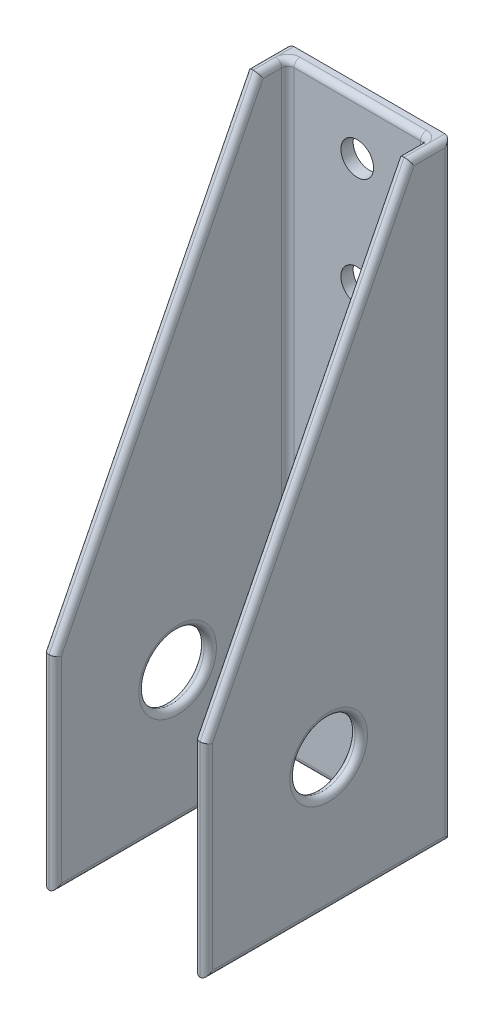
ISO-10303-21;
HEADER;
FILE_DESCRIPTION(('STEP AP214'),'2;1');
FILE_NAME('part.step','',(''),(''),'','','');
FILE_SCHEMA(('AUTOMOTIVE_DESIGN { 1 0 10303 214 1 1 1 1 }'));
ENDSEC;
DATA;
#1=APPLICATION_CONTEXT('core data for automotive mechanical design processes');
#2=APPLICATION_PROTOCOL_DEFINITION('international standard','automotive_design',2000,#1);
#3=PRODUCT_CONTEXT('',#1,'mechanical');
#4=PRODUCT('Part','Part','',(#3));
#5=PRODUCT_RELATED_PRODUCT_CATEGORY('part','',(#4));
#6=PRODUCT_DEFINITION_FORMATION('','',#4);
#7=PRODUCT_DEFINITION_CONTEXT('part definition',#1,'design');
#8=PRODUCT_DEFINITION('design','',#6,#7);
#9=PRODUCT_DEFINITION_SHAPE('','',#8);
#10=(LENGTH_UNIT() NAMED_UNIT(*) SI_UNIT(.MILLI.,.METRE.));
#11=(NAMED_UNIT(*) PLANE_ANGLE_UNIT() SI_UNIT($,.RADIAN.));
#12=(NAMED_UNIT(*) SI_UNIT($,.STERADIAN.) SOLID_ANGLE_UNIT());
#13=UNCERTAINTY_MEASURE_WITH_UNIT(LENGTH_MEASURE(1.E-05),#10,'distance_accuracy_value','');
#14=(GEOMETRIC_REPRESENTATION_CONTEXT(3) GLOBAL_UNCERTAINTY_ASSIGNED_CONTEXT((#13)) GLOBAL_UNIT_ASSIGNED_CONTEXT((#10,
#11,#12)) REPRESENTATION_CONTEXT('',''));
#15=CARTESIAN_POINT('',(0.,0.,0.));
#16=DIRECTION('',(0.,0.,1.));
#17=DIRECTION('',(1.,0.,0.));
#18=AXIS2_PLACEMENT_3D('',#15,#16,#17);
#19=CARTESIAN_POINT('',(-20.,-74.5,60.));
#20=DIRECTION('',(1.,0.,0.));
#21=DIRECTION('',(0.,0.,-1.));
#22=AXIS2_PLACEMENT_3D('',#19,#20,#21);
#23=PLANE('',#22);
#24=DIRECTION('',(0.,0.,-1.));
#25=VECTOR('',#24,1.);
#26=CARTESIAN_POINT('',(-20.,-73.,60.));
#27=LINE('',#26,#25);
#28=CARTESIAN_POINT('',(-20.,-73.,1.5));
#29=VERTEX_POINT('',#28);
#30=CARTESIAN_POINT('',(-20.,-73.,58.5));
#31=VERTEX_POINT('',#30);
#32=EDGE_CURVE('E52',#29,#31,#27,.F.);
#33=ORIENTED_EDGE('',*,*,#32,.T.);
#34=DIRECTION('',(0.,-1.,0.));
#35=VECTOR('',#34,1.);
#36=CARTESIAN_POINT('',(-20.,-24.5,58.5));
#37=LINE('',#36,#35);
#38=CARTESIAN_POINT('',(-20.,-24.8572961996192,58.5));
#39=VERTEX_POINT('',#38);
#40=EDGE_CURVE('E11',#31,#39,#37,.F.);
#41=ORIENTED_EDGE('',*,*,#40,.T.);
#42=DIRECTION('',(0.,0.892616653828402,-0.450816491832526));
#43=VECTOR('',#42,1.);
#44=CARTESIAN_POINT('',(-20.,73.8237752622512,8.66107501925736));
#45=LINE('',#44,#43);
#46=CARTESIAN_POINT('',(-20.,73.,9.07712313150547));
#47=VERTEX_POINT('',#46);
#48=EDGE_CURVE('E200',#39,#47,#45,.T.);
#49=ORIENTED_EDGE('',*,*,#48,.T.);
#50=DIRECTION('',(0.,0.,-1.));
#51=VECTOR('',#50,1.);
#52=CARTESIAN_POINT('',(-20.,73.,60.));
#53=LINE('',#52,#51);
#54=CARTESIAN_POINT('',(-20.,73.,1.5));
#55=VERTEX_POINT('',#54);
#56=EDGE_CURVE('E196',#47,#55,#53,.T.);
#57=ORIENTED_EDGE('',*,*,#56,.T.);
#58=DIRECTION('',(0.,-1.,0.));
#59=VECTOR('',#58,1.);
#60=CARTESIAN_POINT('',(-20.,-74.5,1.5));
#61=LINE('',#60,#59);
#62=EDGE_CURVE('E199',#55,#29,#61,.T.);
#63=ORIENTED_EDGE('',*,*,#62,.T.);
#64=EDGE_LOOP('',(#33,#41,#49,#57,#63));
#65=FACE_BOUND('',#64,.T.);
#66=CARTESIAN_POINT('',(-20.,-42.,30.));
#67=DIRECTION('',(1.,0.,0.));
#68=DIRECTION('',(0.,0.,-1.));
#69=AXIS2_PLACEMENT_3D('',#66,#67,#68);
#70=CIRCLE('',#69,9.5);
#71=CARTESIAN_POINT('',(-20.,-42.,20.5));
#72=VERTEX_POINT('',#71);
#73=EDGE_CURVE('E502',#72,#72,#70,.T.);
#74=ORIENTED_EDGE('',*,*,#73,.T.);
#75=EDGE_LOOP('',(#74));
#76=FACE_BOUND('',#75,.T.);
#77=ADVANCED_FACE('F41',(#65,#76),#23,.F.);
#78=CARTESIAN_POINT('',(20.,-74.5,60.));
#79=DIRECTION('',(-1.,0.,0.));
#80=DIRECTION('',(0.,0.,1.));
#81=AXIS2_PLACEMENT_3D('',#78,#79,#80);
#82=PLANE('',#81);
#83=DIRECTION('',(0.,1.,0.));
#84=VECTOR('',#83,1.);
#85=CARTESIAN_POINT('',(20.,-74.5,1.5));
#86=LINE('',#85,#84);
#87=CARTESIAN_POINT('',(20.,-73.,1.5));
#88=VERTEX_POINT('',#87);
#89=CARTESIAN_POINT('',(20.,73.,1.5));
#90=VERTEX_POINT('',#89);
#91=EDGE_CURVE('E596',#88,#90,#86,.T.);
#92=ORIENTED_EDGE('',*,*,#91,.T.);
#93=DIRECTION('',(0.,0.,-1.));
#94=VECTOR('',#93,1.);
#95=CARTESIAN_POINT('',(20.,73.,60.));
#96=LINE('',#95,#94);
#97=CARTESIAN_POINT('',(20.,73.,9.07712313150548));
#98=VERTEX_POINT('',#97);
#99=EDGE_CURVE('E599',#90,#98,#96,.F.);
#100=ORIENTED_EDGE('',*,*,#99,.T.);
#101=DIRECTION('',(0.,0.892616653828402,-0.450816491832526));
#102=VECTOR('',#101,1.);
#103=CARTESIAN_POINT('',(20.,-25.1762247377488,58.6610750192574));
#104=LINE('',#103,#102);
#105=CARTESIAN_POINT('',(20.,-24.8572961996191,58.5));
#106=VERTEX_POINT('',#105);
#107=EDGE_CURVE('E587',#98,#106,#104,.F.);
#108=ORIENTED_EDGE('',*,*,#107,.T.);
#109=DIRECTION('',(0.,1.,0.));
#110=VECTOR('',#109,1.);
#111=CARTESIAN_POINT('',(20.,-74.5,58.5));
#112=LINE('',#111,#110);
#113=CARTESIAN_POINT('',(20.,-73.,58.5));
#114=VERTEX_POINT('',#113);
#115=EDGE_CURVE('E590',#106,#114,#112,.F.);
#116=ORIENTED_EDGE('',*,*,#115,.T.);
#117=DIRECTION('',(0.,0.,-1.));
#118=VECTOR('',#117,1.);
#119=CARTESIAN_POINT('',(20.,-73.,60.));
#120=LINE('',#119,#118);
#121=EDGE_CURVE('E593',#114,#88,#120,.T.);
#122=ORIENTED_EDGE('',*,*,#121,.T.);
#123=EDGE_LOOP('',(#92,#100,#108,#116,#122));
#124=FACE_BOUND('',#123,.T.);
#125=CARTESIAN_POINT('',(20.,-42.,30.));
#126=DIRECTION('',(-1.,0.,0.));
#127=DIRECTION('',(0.,0.,1.));
#128=AXIS2_PLACEMENT_3D('',#125,#126,#127);
#129=CIRCLE('',#128,9.5);
#130=CARTESIAN_POINT('',(20.,-42.,39.5));
#131=VERTEX_POINT('',#130);
#132=EDGE_CURVE('E583',#131,#131,#129,.T.);
#133=ORIENTED_EDGE('',*,*,#132,.T.);
#134=EDGE_LOOP('',(#133));
#135=FACE_BOUND('',#134,.T.);
#136=ADVANCED_FACE('F340',(#124,#135),#82,.F.);
#137=CARTESIAN_POINT('',(20.,74.5,60.));
#138=DIRECTION('',(0.,-1.,0.));
#139=DIRECTION('',(0.,0.,-1.));
#140=AXIS2_PLACEMENT_3D('',#137,#138,#139);
#141=PLANE('',#140);
#142=CARTESIAN_POINT('',(15.5,74.5,4.5));
#143=DIRECTION('',(0.,-1.,0.));
#144=DIRECTION('',(0.,0.,-1.));
#145=AXIS2_PLACEMENT_3D('',#142,#143,#144);
#146=CIRCLE('',#145,3.);
#147=CARTESIAN_POINT('',(18.5,74.5,4.5));
#148=VERTEX_POINT('',#147);
#149=CARTESIAN_POINT('',(15.5,74.5,1.5));
#150=VERTEX_POINT('',#149);
#151=EDGE_CURVE('E559',#148,#150,#146,.F.);
#152=ORIENTED_EDGE('',*,*,#151,.F.);
#153=DIRECTION('',(0.,0.,-1.));
#154=VECTOR('',#153,1.);
#155=CARTESIAN_POINT('',(18.5,74.5,60.));
#156=LINE('',#155,#154);
#157=CARTESIAN_POINT('',(18.5,74.5,0.));
#158=VERTEX_POINT('',#157);
#159=EDGE_CURVE('E552',#148,#158,#156,.T.);
#160=ORIENTED_EDGE('',*,*,#159,.T.);
#161=DIRECTION('',(-1.,0.,0.));
#162=VECTOR('',#161,1.);
#163=CARTESIAN_POINT('',(20.,74.5,0.));
#164=LINE('',#163,#162);
#165=CARTESIAN_POINT('',(-18.5,74.5,0.));
#166=VERTEX_POINT('',#165);
#167=EDGE_CURVE('E606',#158,#166,#164,.T.);
#168=ORIENTED_EDGE('',*,*,#167,.T.);
#169=DIRECTION('',(0.,0.,-1.));
#170=VECTOR('',#169,1.);
#171=CARTESIAN_POINT('',(-18.5,74.5,60.));
#172=LINE('',#171,#170);
#173=CARTESIAN_POINT('',(-18.5,74.5,4.5));
#174=VERTEX_POINT('',#173);
#175=EDGE_CURVE('E220',#166,#174,#172,.F.);
#176=ORIENTED_EDGE('',*,*,#175,.T.);
#177=CARTESIAN_POINT('',(-15.5,74.5,4.5));
#178=DIRECTION('',(0.,-1.,0.));
#179=DIRECTION('',(0.,0.,-1.));
#180=AXIS2_PLACEMENT_3D('',#177,#178,#179);
#181=CIRCLE('',#180,3.);
#182=CARTESIAN_POINT('',(-15.5,74.5,1.5));
#183=VERTEX_POINT('',#182);
#184=EDGE_CURVE('E632',#183,#174,#181,.F.);
#185=ORIENTED_EDGE('',*,*,#184,.F.);
#186=DIRECTION('',(-1.,0.,0.));
#187=VECTOR('',#186,1.);
#188=CARTESIAN_POINT('',(20.,74.5,1.5));
#189=LINE('',#188,#187);
#190=EDGE_CURVE('E566',#183,#150,#189,.F.);
#191=ORIENTED_EDGE('',*,*,#190,.T.);
#192=EDGE_LOOP('',(#152,#160,#168,#176,#185,#191));
#193=FACE_BOUND('',#192,.T.);
#194=ADVANCED_FACE('F345',(#193),#141,.F.);
#195=CARTESIAN_POINT('',(-17.,-74.5,60.));
#196=DIRECTION('',(-1.,0.,0.));
#197=DIRECTION('',(0.,0.,1.));
#198=AXIS2_PLACEMENT_3D('',#195,#196,#197);
#199=PLANE('',#198);
#200=DIRECTION('',(0.,1.,0.));
#201=VECTOR('',#200,1.);
#202=CARTESIAN_POINT('',(-17.,74.5,4.5));
#203=LINE('',#202,#201);
#204=CARTESIAN_POINT('',(-17.,-73.,4.5));
#205=VERTEX_POINT('',#204);
#206=CARTESIAN_POINT('',(-17.,73.,4.5));
#207=VERTEX_POINT('',#206);
#208=EDGE_CURVE('E495',#205,#207,#203,.T.);
#209=ORIENTED_EDGE('',*,*,#208,.T.);
#210=DIRECTION('',(0.,0.,1.));
#211=VECTOR('',#210,1.);
#212=CARTESIAN_POINT('',(-17.,73.,60.));
#213=LINE('',#212,#211);
#214=CARTESIAN_POINT('',(-17.,73.,9.07712313150548));
#215=VERTEX_POINT('',#214);
#216=EDGE_CURVE('E498',#207,#215,#213,.T.);
#217=ORIENTED_EDGE('',*,*,#216,.T.);
#218=DIRECTION('',(0.,0.892616653828402,-0.450816491832526));
#219=VECTOR('',#218,1.);
#220=CARTESIAN_POINT('',(-17.,-25.1762247377488,58.6610750192574));
#221=LINE('',#220,#219);
#222=CARTESIAN_POINT('',(-17.,-24.8572961996191,58.5));
#223=VERTEX_POINT('',#222);
#224=EDGE_CURVE('E486',#215,#223,#221,.F.);
#225=ORIENTED_EDGE('',*,*,#224,.T.);
#226=DIRECTION('',(0.,1.,0.));
#227=VECTOR('',#226,1.);
#228=CARTESIAN_POINT('',(-17.,-74.5,58.5));
#229=LINE('',#228,#227);
#230=CARTESIAN_POINT('',(-17.,-73.,58.5));
#231=VERTEX_POINT('',#230);
#232=EDGE_CURVE('E489',#223,#231,#229,.F.);
#233=ORIENTED_EDGE('',*,*,#232,.T.);
#234=DIRECTION('',(0.,0.,1.));
#235=VECTOR('',#234,1.);
#236=CARTESIAN_POINT('',(-17.,-73.,60.));
#237=LINE('',#236,#235);
#238=EDGE_CURVE('E492',#231,#205,#237,.F.);
#239=ORIENTED_EDGE('',*,*,#238,.T.);
#240=EDGE_LOOP('',(#209,#217,#225,#233,#239));
#241=FACE_BOUND('',#240,.T.);
#242=CARTESIAN_POINT('',(-17.,-42.,30.));
#243=DIRECTION('',(-1.,0.,0.));
#244=DIRECTION('',(0.,0.,1.));
#245=AXIS2_PLACEMENT_3D('',#242,#243,#244);
#246=CIRCLE('',#245,9.5);
#247=CARTESIAN_POINT('',(-17.,-42.,39.5));
#248=VERTEX_POINT('',#247);
#249=EDGE_CURVE('E482',#248,#248,#246,.T.);
#250=ORIENTED_EDGE('',*,*,#249,.T.);
#251=EDGE_LOOP('',(#250));
#252=FACE_BOUND('',#251,.T.);
#253=ADVANCED_FACE('F673',(#241,#252),#199,.F.);
#254=CARTESIAN_POINT('',(17.,-74.5,60.));
#255=DIRECTION('',(1.,0.,0.));
#256=DIRECTION('',(0.,0.,-1.));
#257=AXIS2_PLACEMENT_3D('',#254,#255,#256);
#258=PLANE('',#257);
#259=DIRECTION('',(0.,0.,-1.));
#260=VECTOR('',#259,1.);
#261=CARTESIAN_POINT('',(17.,-73.,60.));
#262=LINE('',#261,#260);
#263=CARTESIAN_POINT('',(17.,-73.,4.5));
#264=VERTEX_POINT('',#263);
#265=CARTESIAN_POINT('',(17.,-73.,58.5));
#266=VERTEX_POINT('',#265);
#267=EDGE_CURVE('E475',#264,#266,#262,.F.);
#268=ORIENTED_EDGE('',*,*,#267,.T.);
#269=DIRECTION('',(0.,1.,0.));
#270=VECTOR('',#269,1.);
#271=CARTESIAN_POINT('',(17.,-24.5,58.5));
#272=LINE('',#271,#270);
#273=CARTESIAN_POINT('',(17.,-24.8572961996192,58.5));
#274=VERTEX_POINT('',#273);
#275=EDGE_CURVE('E478',#266,#274,#272,.T.);
#276=ORIENTED_EDGE('',*,*,#275,.T.);
#277=DIRECTION('',(0.,-0.892616653828402,0.450816491832526));
#278=VECTOR('',#277,1.);
#279=CARTESIAN_POINT('',(17.,73.8237752622512,8.66107501925738));
#280=LINE('',#279,#278);
#281=CARTESIAN_POINT('',(17.,73.,9.07712313150548));
#282=VERTEX_POINT('',#281);
#283=EDGE_CURVE('E459',#274,#282,#280,.F.);
#284=ORIENTED_EDGE('',*,*,#283,.T.);
#285=DIRECTION('',(0.,0.,-1.));
#286=VECTOR('',#285,1.);
#287=CARTESIAN_POINT('',(17.,73.,60.));
#288=LINE('',#287,#286);
#289=CARTESIAN_POINT('',(17.,73.,4.5));
#290=VERTEX_POINT('',#289);
#291=EDGE_CURVE('E464',#282,#290,#288,.T.);
#292=ORIENTED_EDGE('',*,*,#291,.T.);
#293=DIRECTION('',(0.,1.,0.));
#294=VECTOR('',#293,1.);
#295=CARTESIAN_POINT('',(17.,-74.5,4.5));
#296=LINE('',#295,#294);
#297=EDGE_CURVE('E472',#290,#264,#296,.F.);
#298=ORIENTED_EDGE('',*,*,#297,.T.);
#299=EDGE_LOOP('',(#268,#276,#284,#292,#298));
#300=FACE_BOUND('',#299,.T.);
#301=CARTESIAN_POINT('',(17.,-42.,30.));
#302=DIRECTION('',(1.,0.,0.));
#303=DIRECTION('',(0.,0.,-1.));
#304=AXIS2_PLACEMENT_3D('',#301,#302,#303);
#305=CIRCLE('',#304,9.5);
#306=CARTESIAN_POINT('',(17.,-42.,20.5));
#307=VERTEX_POINT('',#306);
#308=EDGE_CURVE('E456',#307,#307,#305,.T.);
#309=ORIENTED_EDGE('',*,*,#308,.T.);
#310=EDGE_LOOP('',(#309));
#311=FACE_BOUND('',#310,.T.);
#312=ADVANCED_FACE('F654',(#300,#311),#258,.F.);
#313=CARTESIAN_POINT('',(20.,-74.5,60.));
#314=DIRECTION('',(0.,1.,0.));
#315=DIRECTION('',(0.,0.,1.));
#316=AXIS2_PLACEMENT_3D('',#313,#314,#315);
#317=PLANE('',#316);
#318=DIRECTION('',(1.,0.,0.));
#319=VECTOR('',#318,1.);
#320=CARTESIAN_POINT('',(20.,-74.5,0.));
#321=LINE('',#320,#319);
#322=CARTESIAN_POINT('',(-18.5,-74.5,0.));
#323=VERTEX_POINT('',#322);
#324=CARTESIAN_POINT('',(18.5,-74.5,0.));
#325=VERTEX_POINT('',#324);
#326=EDGE_CURVE('E609',#323,#325,#321,.T.);
#327=ORIENTED_EDGE('',*,*,#326,.T.);
#328=DIRECTION('',(0.,0.,-1.));
#329=VECTOR('',#328,1.);
#330=CARTESIAN_POINT('',(18.5,-74.5,60.));
#331=LINE('',#330,#329);
#332=CARTESIAN_POINT('',(18.5,-74.5,4.5));
#333=VERTEX_POINT('',#332);
#334=EDGE_CURVE('E580',#325,#333,#331,.F.);
#335=ORIENTED_EDGE('',*,*,#334,.T.);
#336=CARTESIAN_POINT('',(15.5,-74.5,4.5));
#337=DIRECTION('',(0.,1.,0.));
#338=DIRECTION('',(0.,0.,1.));
#339=AXIS2_PLACEMENT_3D('',#336,#337,#338);
#340=CIRCLE('',#339,3.);
#341=CARTESIAN_POINT('',(15.5,-74.5,1.5));
#342=VERTEX_POINT('',#341);
#343=EDGE_CURVE('E576',#342,#333,#340,.F.);
#344=ORIENTED_EDGE('',*,*,#343,.F.);
#345=DIRECTION('',(-1.,0.,0.));
#346=VECTOR('',#345,1.);
#347=CARTESIAN_POINT('',(20.,-74.5,1.5));
#348=LINE('',#347,#346);
#349=CARTESIAN_POINT('',(-15.5,-74.5,1.5));
#350=VERTEX_POINT('',#349);
#351=EDGE_CURVE('E573',#342,#350,#348,.T.);
#352=ORIENTED_EDGE('',*,*,#351,.T.);
#353=CARTESIAN_POINT('',(-15.5,-74.5,4.5));
#354=DIRECTION('',(0.,1.,0.));
#355=DIRECTION('',(0.,0.,1.));
#356=AXIS2_PLACEMENT_3D('',#353,#354,#355);
#357=CIRCLE('',#356,3.);
#358=CARTESIAN_POINT('',(-18.5,-74.5,4.5));
#359=VERTEX_POINT('',#358);
#360=EDGE_CURVE('E563',#359,#350,#357,.F.);
#361=ORIENTED_EDGE('',*,*,#360,.F.);
#362=DIRECTION('',(0.,0.,-1.));
#363=VECTOR('',#362,1.);
#364=CARTESIAN_POINT('',(-18.5,-74.5,60.));
#365=LINE('',#364,#363);
#366=EDGE_CURVE('E558',#359,#323,#365,.T.);
#367=ORIENTED_EDGE('',*,*,#366,.T.);
#368=EDGE_LOOP('',(#327,#335,#344,#352,#361,#367));
#369=FACE_BOUND('',#368,.T.);
#370=ADVANCED_FACE('F350',(#369),#317,.F.);
#371=CARTESIAN_POINT('',(0.,0.,0.));
#372=DIRECTION('',(0.,0.,1.));
#373=DIRECTION('',(1.,0.,0.));
#374=AXIS2_PLACEMENT_3D('',#371,#372,#373);
#375=PLANE('',#374);
#376=CARTESIAN_POINT('',(0.,61.5,0.));
#377=DIRECTION('',(0.,0.,1.));
#378=DIRECTION('',(1.,0.,0.));
#379=AXIS2_PLACEMENT_3D('',#376,#377,#378);
#380=CIRCLE('',#379,4.00000000000001);
#381=CARTESIAN_POINT('',(4.00000000000001,61.5,0.));
#382=VERTEX_POINT('',#381);
#383=EDGE_CURVE('E617',#382,#382,#380,.T.);
#384=ORIENTED_EDGE('',*,*,#383,.T.);
#385=EDGE_LOOP('',(#384));
#386=FACE_BOUND('',#385,.T.);
#387=CARTESIAN_POINT('',(0.,34.5,0.));
#388=DIRECTION('',(0.,0.,1.));
#389=DIRECTION('',(1.,0.,0.));
#390=AXIS2_PLACEMENT_3D('',#387,#388,#389);
#391=CIRCLE('',#390,4.);
#392=CARTESIAN_POINT('',(4.,34.5,0.));
#393=VERTEX_POINT('',#392);
#394=EDGE_CURVE('E699',#393,#393,#391,.T.);
#395=ORIENTED_EDGE('',*,*,#394,.T.);
#396=EDGE_LOOP('',(#395));
#397=FACE_BOUND('',#396,.T.);
#398=CARTESIAN_POINT('',(0.,7.5,0.));
#399=DIRECTION('',(0.,0.,1.));
#400=DIRECTION('',(1.,0.,0.));
#401=AXIS2_PLACEMENT_3D('',#398,#399,#400);
#402=CIRCLE('',#401,4.);
#403=CARTESIAN_POINT('',(4.,7.5,0.));
#404=VERTEX_POINT('',#403);
#405=EDGE_CURVE('E702',#404,#404,#402,.T.);
#406=ORIENTED_EDGE('',*,*,#405,.T.);
#407=EDGE_LOOP('',(#406));
#408=FACE_BOUND('',#407,.T.);
#409=ORIENTED_EDGE('',*,*,#167,.F.);
#410=DIRECTION('',(0.,1.,0.));
#411=VECTOR('',#410,1.);
#412=CARTESIAN_POINT('',(18.5,0.,0.));
#413=LINE('',#412,#411);
#414=EDGE_CURVE('E460',#158,#325,#413,.F.);
#415=ORIENTED_EDGE('',*,*,#414,.T.);
#416=ORIENTED_EDGE('',*,*,#326,.F.);
#417=DIRECTION('',(0.,-1.,0.));
#418=VECTOR('',#417,1.);
#419=CARTESIAN_POINT('',(-18.5,0.,0.));
#420=LINE('',#419,#418);
#421=EDGE_CURVE('E466',#323,#166,#420,.F.);
#422=ORIENTED_EDGE('',*,*,#421,.T.);
#423=EDGE_LOOP('',(#409,#415,#416,#422));
#424=FACE_BOUND('',#423,.T.);
#425=ADVANCED_FACE('F605',(#386,#397,#408,#424),#375,.F.);
#426=CARTESIAN_POINT('',(-17.,-74.5,3.));
#427=DIRECTION('',(0.,0.,-1.));
#428=DIRECTION('',(-1.,0.,0.));
#429=AXIS2_PLACEMENT_3D('',#426,#427,#428);
#430=PLANE('',#429);
#431=DIRECTION('',(-1.,0.,0.));
#432=VECTOR('',#431,1.);
#433=CARTESIAN_POINT('',(-17.,-73.,3.));
#434=LINE('',#433,#432);
#435=CARTESIAN_POINT('',(-15.5,-73.,3.));
#436=VERTEX_POINT('',#435);
#437=CARTESIAN_POINT('',(15.5,-73.,3.));
#438=VERTEX_POINT('',#437);
#439=EDGE_CURVE('E615',#436,#438,#434,.F.);
#440=ORIENTED_EDGE('',*,*,#439,.T.);
#441=DIRECTION('',(0.,1.,0.));
#442=VECTOR('',#441,1.);
#443=CARTESIAN_POINT('',(15.5,74.5,3.));
#444=LINE('',#443,#442);
#445=CARTESIAN_POINT('',(15.5,73.,3.));
#446=VERTEX_POINT('',#445);
#447=EDGE_CURVE('E627',#438,#446,#444,.T.);
#448=ORIENTED_EDGE('',*,*,#447,.T.);
#449=DIRECTION('',(-1.,0.,0.));
#450=VECTOR('',#449,1.);
#451=CARTESIAN_POINT('',(-17.,73.,3.));
#452=LINE('',#451,#450);
#453=CARTESIAN_POINT('',(-15.5,73.,3.));
#454=VERTEX_POINT('',#453);
#455=EDGE_CURVE('E623',#446,#454,#452,.T.);
#456=ORIENTED_EDGE('',*,*,#455,.T.);
#457=DIRECTION('',(0.,1.,0.));
#458=VECTOR('',#457,1.);
#459=CARTESIAN_POINT('',(-15.5,-74.5,3.));
#460=LINE('',#459,#458);
#461=EDGE_CURVE('E611',#454,#436,#460,.F.);
#462=ORIENTED_EDGE('',*,*,#461,.T.);
#463=EDGE_LOOP('',(#440,#448,#456,#462));
#464=FACE_BOUND('',#463,.T.);
#465=CARTESIAN_POINT('',(0.,61.5,3.));
#466=DIRECTION('',(0.,0.,1.));
#467=DIRECTION('',(1.,0.,0.));
#468=AXIS2_PLACEMENT_3D('',#465,#466,#467);
#469=CIRCLE('',#468,4.00000000000001);
#470=CARTESIAN_POINT('',(4.00000000000001,61.5,3.));
#471=VERTEX_POINT('',#470);
#472=EDGE_CURVE('E715',#471,#471,#469,.T.);
#473=ORIENTED_EDGE('',*,*,#472,.F.);
#474=EDGE_LOOP('',(#473));
#475=FACE_BOUND('',#474,.T.);
#476=CARTESIAN_POINT('',(0.,34.5,3.));
#477=DIRECTION('',(0.,0.,1.));
#478=DIRECTION('',(1.,0.,0.));
#479=AXIS2_PLACEMENT_3D('',#476,#477,#478);
#480=CIRCLE('',#479,4.);
#481=CARTESIAN_POINT('',(4.,34.5,3.));
#482=VERTEX_POINT('',#481);
#483=EDGE_CURVE('E705',#482,#482,#480,.T.);
#484=ORIENTED_EDGE('',*,*,#483,.F.);
#485=EDGE_LOOP('',(#484));
#486=FACE_BOUND('',#485,.T.);
#487=CARTESIAN_POINT('',(0.,7.5,3.));
#488=DIRECTION('',(0.,0.,1.));
#489=DIRECTION('',(1.,0.,0.));
#490=AXIS2_PLACEMENT_3D('',#487,#488,#489);
#491=CIRCLE('',#490,4.);
#492=CARTESIAN_POINT('',(4.,7.5,3.));
#493=VERTEX_POINT('',#492);
#494=EDGE_CURVE('E313',#493,#493,#491,.T.);
#495=ORIENTED_EDGE('',*,*,#494,.F.);
#496=EDGE_LOOP('',(#495));
#497=FACE_BOUND('',#496,.T.);
#498=ADVANCED_FACE('F645',(#464,#475,#486,#497),#430,.F.);
#499=CARTESIAN_POINT('',(0.,7.5,0.));
#500=DIRECTION('',(0.,0.,1.));
#501=DIRECTION('',(1.,0.,0.));
#502=AXIS2_PLACEMENT_3D('',#499,#500,#501);
#503=CYLINDRICAL_SURFACE('',#502,4.);
#504=ORIENTED_EDGE('',*,*,#405,.F.);
#505=EDGE_LOOP('',(#504));
#506=FACE_BOUND('',#505,.T.);
#507=ORIENTED_EDGE('',*,*,#494,.T.);
#508=EDGE_LOOP('',(#507));
#509=FACE_BOUND('',#508,.T.);
#510=ADVANCED_FACE('F692',(#506,#509),#503,.F.);
#511=CARTESIAN_POINT('',(0.,34.5,0.));
#512=DIRECTION('',(0.,0.,1.));
#513=DIRECTION('',(1.,0.,0.));
#514=AXIS2_PLACEMENT_3D('',#511,#512,#513);
#515=CYLINDRICAL_SURFACE('',#514,4.);
#516=ORIENTED_EDGE('',*,*,#394,.F.);
#517=EDGE_LOOP('',(#516));
#518=FACE_BOUND('',#517,.T.);
#519=ORIENTED_EDGE('',*,*,#483,.T.);
#520=EDGE_LOOP('',(#519));
#521=FACE_BOUND('',#520,.T.);
#522=ADVANCED_FACE('F728',(#518,#521),#515,.F.);
#523=CARTESIAN_POINT('',(0.,61.5,0.));
#524=DIRECTION('',(0.,0.,1.));
#525=DIRECTION('',(1.,0.,0.));
#526=AXIS2_PLACEMENT_3D('',#523,#524,#525);
#527=CYLINDRICAL_SURFACE('',#526,4.00000000000001);
#528=ORIENTED_EDGE('',*,*,#383,.F.);
#529=EDGE_LOOP('',(#528));
#530=FACE_BOUND('',#529,.T.);
#531=ORIENTED_EDGE('',*,*,#472,.T.);
#532=EDGE_LOOP('',(#531));
#533=FACE_BOUND('',#532,.T.);
#534=ADVANCED_FACE('F446',(#530,#533),#527,.F.);
#535=CARTESIAN_POINT('',(18.5,0.,58.5));
#536=DIRECTION('',(0.,-1.,0.));
#537=DIRECTION('',(0.,0.,-1.));
#538=AXIS2_PLACEMENT_3D('',#535,#536,#537);
#539=CYLINDRICAL_SURFACE('',#538,1.5);
#540=CARTESIAN_POINT('',(18.5,-73.,58.5));
#541=DIRECTION('',(0.,-0.707106781186547,-0.707106781186547));
#542=DIRECTION('',(0.,-0.707106781186547,0.707106781186547));
#543=AXIS2_PLACEMENT_3D('',#540,#541,#542);
#544=ELLIPSE('',#543,2.12132034355964,1.5);
#545=CARTESIAN_POINT('',(18.5,-74.5,60.));
#546=VERTEX_POINT('',#545);
#547=EDGE_CURVE('E88',#114,#546,#544,.T.);
#548=ORIENTED_EDGE('',*,*,#547,.F.);
#549=ORIENTED_EDGE('',*,*,#115,.F.);
#550=CARTESIAN_POINT('',(18.5,-24.8572961996192,58.5));
#551=DIRECTION('',(0.,-0.972783802761025,0.231714637185049));
#552=DIRECTION('',(0.,0.231714637185049,0.972783802761025));
#553=AXIS2_PLACEMENT_3D('',#550,#551,#552);
#554=ELLIPSE('',#553,1.54196646340388,1.5);
#555=CARTESIAN_POINT('',(18.5,-24.5,60.));
#556=VERTEX_POINT('',#555);
#557=EDGE_CURVE('E302',#556,#106,#554,.F.);
#558=ORIENTED_EDGE('',*,*,#557,.F.);
#559=DIRECTION('',(0.,1.,0.));
#560=VECTOR('',#559,1.);
#561=CARTESIAN_POINT('',(18.5,-24.5,60.));
#562=LINE('',#561,#560);
#563=EDGE_CURVE('E298',#546,#556,#562,.T.);
#564=ORIENTED_EDGE('',*,*,#563,.F.);
#565=EDGE_LOOP('',(#548,#549,#558,#564));
#566=FACE_BOUND('',#565,.T.);
#567=ADVANCED_FACE('F442',(#566),#539,.T.);
#568=CARTESIAN_POINT('',(-18.5,0.,58.5));
#569=DIRECTION('',(0.,1.,0.));
#570=DIRECTION('',(0.,0.,1.));
#571=AXIS2_PLACEMENT_3D('',#568,#569,#570);
#572=CYLINDRICAL_SURFACE('',#571,1.5);
#573=CARTESIAN_POINT('',(-18.5,-24.8572961996192,58.5));
#574=DIRECTION('',(0.,-0.972783802761025,0.231714637185049));
#575=DIRECTION('',(0.,0.231714637185049,0.972783802761025));
#576=AXIS2_PLACEMENT_3D('',#573,#574,#575);
#577=ELLIPSE('',#576,1.54196646340388,1.5);
#578=CARTESIAN_POINT('',(-18.5,-24.5,60.));
#579=VERTEX_POINT('',#578);
#580=EDGE_CURVE('E274',#39,#579,#577,.F.);
#581=ORIENTED_EDGE('',*,*,#580,.F.);
#582=ORIENTED_EDGE('',*,*,#40,.F.);
#583=CARTESIAN_POINT('',(-18.5,-73.,58.5));
#584=DIRECTION('',(0.,-0.707106781186547,-0.707106781186547));
#585=DIRECTION('',(0.,0.707106781186547,-0.707106781186547));
#586=AXIS2_PLACEMENT_3D('',#583,#584,#585);
#587=ELLIPSE('',#586,2.12132034355964,1.5);
#588=CARTESIAN_POINT('',(-18.5,-74.5,60.));
#589=VERTEX_POINT('',#588);
#590=EDGE_CURVE('E80',#589,#31,#587,.T.);
#591=ORIENTED_EDGE('',*,*,#590,.F.);
#592=DIRECTION('',(0.,-1.,0.));
#593=VECTOR('',#592,1.);
#594=CARTESIAN_POINT('',(-18.5,-74.5,60.));
#595=LINE('',#594,#593);
#596=EDGE_CURVE('E278',#579,#589,#595,.T.);
#597=ORIENTED_EDGE('',*,*,#596,.F.);
#598=EDGE_LOOP('',(#581,#582,#591,#597));
#599=FACE_BOUND('',#598,.T.);
#600=ADVANCED_FACE('F439',(#599),#572,.T.);
#601=CARTESIAN_POINT('',(18.5,-73.,60.));
#602=DIRECTION('',(0.,0.,-1.));
#603=DIRECTION('',(-1.,0.,0.));
#604=AXIS2_PLACEMENT_3D('',#601,#602,#603);
#605=CYLINDRICAL_SURFACE('',#604,1.5);
#606=DIRECTION('',(0.,0.,-1.));
#607=VECTOR('',#606,1.);
#608=CARTESIAN_POINT('',(18.5,-74.5,60.));
#609=LINE('',#608,#607);
#610=EDGE_CURVE('E290',#333,#546,#609,.F.);
#611=ORIENTED_EDGE('',*,*,#610,.F.);
#612=ORIENTED_EDGE('',*,*,#334,.F.);
#613=CARTESIAN_POINT('',(18.5,-73.,1.5));
#614=DIRECTION('',(0.,0.707106781186547,-0.707106781186547));
#615=DIRECTION('',(0.,-0.707106781186547,-0.707106781186547));
#616=AXIS2_PLACEMENT_3D('',#613,#614,#615);
#617=ELLIPSE('',#616,2.12132034355964,1.5);
#618=EDGE_CURVE('E306',#88,#325,#617,.T.);
#619=ORIENTED_EDGE('',*,*,#618,.F.);
#620=ORIENTED_EDGE('',*,*,#121,.F.);
#621=ORIENTED_EDGE('',*,*,#547,.T.);
#622=EDGE_LOOP('',(#611,#612,#619,#620,#621));
#623=FACE_BOUND('',#622,.T.);
#624=ADVANCED_FACE('F437',(#623),#605,.T.);
#625=CARTESIAN_POINT('',(-18.5,-73.,60.));
#626=DIRECTION('',(0.,0.,-1.));
#627=DIRECTION('',(-1.,0.,0.));
#628=AXIS2_PLACEMENT_3D('',#625,#626,#627);
#629=CYLINDRICAL_SURFACE('',#628,1.5);
#630=CARTESIAN_POINT('',(-18.5,-73.,1.5));
#631=DIRECTION('',(0.,-0.707106781186547,0.707106781186547));
#632=DIRECTION('',(0.,-0.707106781186547,-0.707106781186547));
#633=AXIS2_PLACEMENT_3D('',#630,#631,#632);
#634=ELLIPSE('',#633,2.12132034355964,1.5);
#635=EDGE_CURVE('E215',#323,#29,#634,.F.);
#636=ORIENTED_EDGE('',*,*,#635,.F.);
#637=ORIENTED_EDGE('',*,*,#366,.F.);
#638=DIRECTION('',(0.,0.,-1.));
#639=VECTOR('',#638,1.);
#640=CARTESIAN_POINT('',(-18.5,-74.5,60.));
#641=LINE('',#640,#639);
#642=EDGE_CURVE('E286',#589,#359,#641,.T.);
#643=ORIENTED_EDGE('',*,*,#642,.F.);
#644=ORIENTED_EDGE('',*,*,#590,.T.);
#645=ORIENTED_EDGE('',*,*,#32,.F.);
#646=EDGE_LOOP('',(#636,#637,#643,#644,#645));
#647=FACE_BOUND('',#646,.T.);
#648=ADVANCED_FACE('F433',(#647),#629,.T.);
#649=CARTESIAN_POINT('',(18.5,-74.5,1.5));
#650=DIRECTION('',(0.,1.,0.));
#651=DIRECTION('',(0.,0.,1.));
#652=AXIS2_PLACEMENT_3D('',#649,#650,#651);
#653=CYLINDRICAL_SURFACE('',#652,1.5);
#654=ORIENTED_EDGE('',*,*,#618,.T.);
#655=ORIENTED_EDGE('',*,*,#414,.F.);
#656=CARTESIAN_POINT('',(18.5,73.,1.5));
#657=DIRECTION('',(0.,0.707106781186547,0.707106781186547));
#658=DIRECTION('',(0.,0.707106781186547,-0.707106781186547));
#659=AXIS2_PLACEMENT_3D('',#656,#657,#658);
#660=ELLIPSE('',#659,2.12132034355964,1.5);
#661=EDGE_CURVE('E268',#90,#158,#660,.T.);
#662=ORIENTED_EDGE('',*,*,#661,.F.);
#663=ORIENTED_EDGE('',*,*,#91,.F.);
#664=EDGE_LOOP('',(#654,#655,#662,#663));
#665=FACE_BOUND('',#664,.T.);
#666=ADVANCED_FACE('F429',(#665),#653,.T.);
#667=CARTESIAN_POINT('',(18.5,18.4888837900132,36.6079899042261));
#668=DIRECTION('',(0.,-0.892616653828402,0.450816491832526));
#669=DIRECTION('',(0.,-0.450816491832526,-0.892616653828402));
#670=AXIS2_PLACEMENT_3D('',#667,#668,#669);
#671=CYLINDRICAL_SURFACE('',#670,1.5);
#672=ORIENTED_EDGE('',*,*,#557,.T.);
#673=ORIENTED_EDGE('',*,*,#107,.F.);
#674=CARTESIAN_POINT('',(18.5,73.,9.07712313150548));
#675=DIRECTION('',(0.,-0.524015032307029,0.851709014814487));
#676=DIRECTION('',(0.,-0.851709014814487,-0.524015032307029));
#677=AXIS2_PLACEMENT_3D('',#674,#675,#676);
#678=ELLIPSE('',#677,1.76116487428129,1.5);
#679=CARTESIAN_POINT('',(18.5,74.5,9.99999999999999));
#680=VERTEX_POINT('',#679);
#681=EDGE_CURVE('E265',#680,#98,#678,.F.);
#682=ORIENTED_EDGE('',*,*,#681,.F.);
#683=DIRECTION('',(0.,0.892616653828402,-0.450816491832526));
#684=VECTOR('',#683,1.);
#685=CARTESIAN_POINT('',(18.5,74.5,9.99999999999998));
#686=LINE('',#685,#684);
#687=EDGE_CURVE('E261',#556,#680,#686,.T.);
#688=ORIENTED_EDGE('',*,*,#687,.F.);
#689=EDGE_LOOP('',(#672,#673,#682,#688));
#690=FACE_BOUND('',#689,.T.);
#691=ADVANCED_FACE('F425',(#690),#671,.T.);
#692=CARTESIAN_POINT('',(18.5,-74.5,58.5));
#693=DIRECTION('',(0.,-1.,0.));
#694=DIRECTION('',(0.,0.,-1.));
#695=AXIS2_PLACEMENT_3D('',#692,#693,#694);
#696=CYLINDRICAL_SURFACE('',#695,1.5);
#697=CARTESIAN_POINT('',(18.5,-24.8572961996191,58.5));
#698=DIRECTION('',(0.,0.972783802761025,-0.231714637185049));
#699=DIRECTION('',(0.,-0.231714637185049,-0.972783802761025));
#700=AXIS2_PLACEMENT_3D('',#697,#698,#699);
#701=ELLIPSE('',#700,1.54196646340388,1.5);
#702=EDGE_CURVE('E257',#274,#556,#701,.T.);
#703=ORIENTED_EDGE('',*,*,#702,.F.);
#704=ORIENTED_EDGE('',*,*,#275,.F.);
#705=CARTESIAN_POINT('',(18.5,-73.,58.5));
#706=DIRECTION('',(0.,-0.707106781186547,-0.707106781186547));
#707=DIRECTION('',(0.,0.707106781186547,-0.707106781186547));
#708=AXIS2_PLACEMENT_3D('',#705,#706,#707);
#709=ELLIPSE('',#708,2.12132034355964,1.5);
#710=EDGE_CURVE('E294',#546,#266,#709,.T.);
#711=ORIENTED_EDGE('',*,*,#710,.F.);
#712=ORIENTED_EDGE('',*,*,#563,.T.);
#713=EDGE_LOOP('',(#703,#704,#711,#712));
#714=FACE_BOUND('',#713,.T.);
#715=ADVANCED_FACE('F421',(#714),#696,.T.);
#716=CARTESIAN_POINT('',(18.5,-73.,60.));
#717=DIRECTION('',(0.,0.,-1.));
#718=DIRECTION('',(-1.,0.,0.));
#719=AXIS2_PLACEMENT_3D('',#716,#717,#718);
#720=CYLINDRICAL_SURFACE('',#719,1.5);
#721=ORIENTED_EDGE('',*,*,#710,.T.);
#722=ORIENTED_EDGE('',*,*,#267,.F.);
#723=CARTESIAN_POINT('',(18.5,-73.,4.5));
#724=DIRECTION('',(0.,0.,-1.));
#725=DIRECTION('',(-1.,0.,0.));
#726=AXIS2_PLACEMENT_3D('',#723,#724,#725);
#727=CIRCLE('',#726,1.5);
#728=EDGE_CURVE('E253',#333,#264,#727,.T.);
#729=ORIENTED_EDGE('',*,*,#728,.F.);
#730=ORIENTED_EDGE('',*,*,#610,.T.);
#731=EDGE_LOOP('',(#721,#722,#729,#730));
#732=FACE_BOUND('',#731,.T.);
#733=ADVANCED_FACE('F417',(#732),#720,.T.);
#734=CARTESIAN_POINT('',(20.,-73.,1.5));
#735=DIRECTION('',(-1.,0.,0.));
#736=DIRECTION('',(0.,0.,1.));
#737=AXIS2_PLACEMENT_3D('',#734,#735,#736);
#738=CYLINDRICAL_SURFACE('',#737,1.5);
#739=CARTESIAN_POINT('',(-15.5,-73.,1.5));
#740=DIRECTION('',(-1.,0.,0.));
#741=DIRECTION('',(0.,0.,1.));
#742=AXIS2_PLACEMENT_3D('',#739,#740,#741);
#743=CIRCLE('',#742,1.5);
#744=EDGE_CURVE('E245',#350,#436,#743,.T.);
#745=ORIENTED_EDGE('',*,*,#744,.F.);
#746=ORIENTED_EDGE('',*,*,#351,.F.);
#747=CARTESIAN_POINT('',(15.5,-73.,1.5));
#748=DIRECTION('',(1.,0.,0.));
#749=DIRECTION('',(0.,0.,-1.));
#750=AXIS2_PLACEMENT_3D('',#747,#748,#749);
#751=CIRCLE('',#750,1.5);
#752=EDGE_CURVE('E249',#438,#342,#751,.T.);
#753=ORIENTED_EDGE('',*,*,#752,.F.);
#754=ORIENTED_EDGE('',*,*,#439,.F.);
#755=EDGE_LOOP('',(#745,#746,#753,#754));
#756=FACE_BOUND('',#755,.T.);
#757=ADVANCED_FACE('F413',(#756),#738,.T.);
#758=CARTESIAN_POINT('',(-18.5,-73.,60.));
#759=DIRECTION('',(0.,0.,1.));
#760=DIRECTION('',(1.,0.,0.));
#761=AXIS2_PLACEMENT_3D('',#758,#759,#760);
#762=CYLINDRICAL_SURFACE('',#761,1.5);
#763=CARTESIAN_POINT('',(-18.5,-73.,4.5));
#764=DIRECTION('',(0.,0.,-1.));
#765=DIRECTION('',(-1.,0.,0.));
#766=AXIS2_PLACEMENT_3D('',#763,#764,#765);
#767=CIRCLE('',#766,1.5);
#768=EDGE_CURVE('E241',#205,#359,#767,.T.);
#769=ORIENTED_EDGE('',*,*,#768,.F.);
#770=ORIENTED_EDGE('',*,*,#238,.F.);
#771=CARTESIAN_POINT('',(-18.5,-73.,58.5));
#772=DIRECTION('',(0.,-0.707106781186547,-0.707106781186547));
#773=DIRECTION('',(0.,-0.707106781186547,0.707106781186547));
#774=AXIS2_PLACEMENT_3D('',#771,#772,#773);
#775=ELLIPSE('',#774,2.12132034355964,1.5);
#776=EDGE_CURVE('E282',#589,#231,#775,.F.);
#777=ORIENTED_EDGE('',*,*,#776,.F.);
#778=ORIENTED_EDGE('',*,*,#642,.T.);
#779=EDGE_LOOP('',(#769,#770,#777,#778));
#780=FACE_BOUND('',#779,.T.);
#781=ADVANCED_FACE('F409',(#780),#762,.T.);
#782=CARTESIAN_POINT('',(-18.5,0.,58.5));
#783=DIRECTION('',(0.,-1.,0.));
#784=DIRECTION('',(0.,0.,-1.));
#785=AXIS2_PLACEMENT_3D('',#782,#783,#784);
#786=CYLINDRICAL_SURFACE('',#785,1.5);
#787=ORIENTED_EDGE('',*,*,#776,.T.);
#788=ORIENTED_EDGE('',*,*,#232,.F.);
#789=CARTESIAN_POINT('',(-18.5,-24.8572961996192,58.5));
#790=DIRECTION('',(0.,-0.972783802761025,0.231714637185049));
#791=DIRECTION('',(0.,0.231714637185049,0.972783802761025));
#792=AXIS2_PLACEMENT_3D('',#789,#790,#791);
#793=ELLIPSE('',#792,1.54196646340388,1.5);
#794=EDGE_CURVE('E237',#579,#223,#793,.F.);
#795=ORIENTED_EDGE('',*,*,#794,.F.);
#796=ORIENTED_EDGE('',*,*,#596,.T.);
#797=EDGE_LOOP('',(#787,#788,#795,#796));
#798=FACE_BOUND('',#797,.T.);
#799=ADVANCED_FACE('F405',(#798),#786,.T.);
#800=CARTESIAN_POINT('',(-18.5,-65.0144492723395,78.7813904407678));
#801=DIRECTION('',(0.,-0.892616653828402,0.450816491832526));
#802=DIRECTION('',(0.,-0.450816491832526,-0.892616653828402));
#803=AXIS2_PLACEMENT_3D('',#800,#801,#802);
#804=CYLINDRICAL_SURFACE('',#803,1.5);
#805=ORIENTED_EDGE('',*,*,#48,.F.);
#806=ORIENTED_EDGE('',*,*,#580,.T.);
#807=DIRECTION('',(0.,0.892616653828402,-0.450816491832526));
#808=VECTOR('',#807,1.);
#809=CARTESIAN_POINT('',(-18.5,-24.5,60.));
#810=LINE('',#809,#808);
#811=CARTESIAN_POINT('',(-18.5,74.5,9.99999999999998));
#812=VERTEX_POINT('',#811);
#813=EDGE_CURVE('E227',#812,#579,#810,.F.);
#814=ORIENTED_EDGE('',*,*,#813,.F.);
#815=CARTESIAN_POINT('',(-18.5,73.,9.07712313150548));
#816=DIRECTION('',(0.,-0.524015032307029,0.851709014814487));
#817=DIRECTION('',(0.,-0.851709014814487,-0.524015032307029));
#818=AXIS2_PLACEMENT_3D('',#815,#816,#817);
#819=ELLIPSE('',#818,1.76116487428129,1.5);
#820=EDGE_CURVE('E222',#47,#812,#819,.F.);
#821=ORIENTED_EDGE('',*,*,#820,.F.);
#822=EDGE_LOOP('',(#805,#806,#814,#821));
#823=FACE_BOUND('',#822,.T.);
#824=ADVANCED_FACE('F402',(#823),#804,.T.);
#825=CARTESIAN_POINT('',(-18.5,-74.5,1.5));
#826=DIRECTION('',(0.,-1.,0.));
#827=DIRECTION('',(0.,0.,-1.));
#828=AXIS2_PLACEMENT_3D('',#825,#826,#827);
#829=CYLINDRICAL_SURFACE('',#828,1.5);
#830=ORIENTED_EDGE('',*,*,#635,.T.);
#831=ORIENTED_EDGE('',*,*,#62,.F.);
#832=CARTESIAN_POINT('',(-18.5,73.,1.5));
#833=DIRECTION('',(0.,-0.707106781186547,-0.707106781186547));
#834=DIRECTION('',(0.,0.707106781186547,-0.707106781186547));
#835=AXIS2_PLACEMENT_3D('',#832,#833,#834);
#836=ELLIPSE('',#835,2.12132034355964,1.5);
#837=EDGE_CURVE('E212',#166,#55,#836,.F.);
#838=ORIENTED_EDGE('',*,*,#837,.F.);
#839=ORIENTED_EDGE('',*,*,#421,.F.);
#840=EDGE_LOOP('',(#830,#831,#838,#839));
#841=FACE_BOUND('',#840,.T.);
#842=ADVANCED_FACE('F210',(#841),#829,.T.);
#843=CARTESIAN_POINT('',(18.5,73.,60.));
#844=DIRECTION('',(0.,0.,-1.));
#845=DIRECTION('',(-1.,0.,0.));
#846=AXIS2_PLACEMENT_3D('',#843,#844,#845);
#847=CYLINDRICAL_SURFACE('',#846,1.5);
#848=ORIENTED_EDGE('',*,*,#661,.T.);
#849=ORIENTED_EDGE('',*,*,#159,.F.);
#850=DIRECTION('',(0.,0.,-1.));
#851=VECTOR('',#850,1.);
#852=CARTESIAN_POINT('',(18.5,74.5,60.));
#853=LINE('',#852,#851);
#854=EDGE_CURVE('E223',#680,#148,#853,.T.);
#855=ORIENTED_EDGE('',*,*,#854,.F.);
#856=ORIENTED_EDGE('',*,*,#681,.T.);
#857=ORIENTED_EDGE('',*,*,#99,.F.);
#858=EDGE_LOOP('',(#848,#849,#855,#856,#857));
#859=FACE_BOUND('',#858,.T.);
#860=ADVANCED_FACE('F395',(#859),#847,.T.);
#861=CARTESIAN_POINT('',(18.5,18.4888837900132,36.6079899042261));
#862=DIRECTION('',(0.,0.892616653828402,-0.450816491832526));
#863=DIRECTION('',(0.,0.450816491832526,0.892616653828402));
#864=AXIS2_PLACEMENT_3D('',#861,#862,#863);
#865=CYLINDRICAL_SURFACE('',#864,1.5);
#866=ORIENTED_EDGE('',*,*,#702,.T.);
#867=ORIENTED_EDGE('',*,*,#687,.T.);
#868=CARTESIAN_POINT('',(18.5,73.,9.07712313150548));
#869=DIRECTION('',(0.,0.524015032307029,-0.851709014814487));
#870=DIRECTION('',(0.,0.851709014814487,0.524015032307029));
#871=AXIS2_PLACEMENT_3D('',#868,#869,#870);
#872=ELLIPSE('',#871,1.76116487428129,1.5);
#873=EDGE_CURVE('E230',#282,#680,#872,.T.);
#874=ORIENTED_EDGE('',*,*,#873,.F.);
#875=ORIENTED_EDGE('',*,*,#283,.F.);
#876=EDGE_LOOP('',(#866,#867,#874,#875));
#877=FACE_BOUND('',#876,.T.);
#878=ADVANCED_FACE('F391',(#877),#865,.T.);
#879=CARTESIAN_POINT('',(15.5,-73.,4.5));
#880=DIRECTION('',(0.,1.,0.));
#881=DIRECTION('',(0.,0.,1.));
#882=AXIS2_PLACEMENT_3D('',#879,#880,#881);
#883=TOROIDAL_SURFACE('',#882,3.,1.5);
#884=ORIENTED_EDGE('',*,*,#343,.T.);
#885=ORIENTED_EDGE('',*,*,#728,.T.);
#886=CARTESIAN_POINT('',(15.5,-73.,4.5));
#887=DIRECTION('',(0.,1.,0.));
#888=DIRECTION('',(0.,0.,1.));
#889=AXIS2_PLACEMENT_3D('',#886,#887,#888);
#890=CIRCLE('',#889,1.5);
#891=EDGE_CURVE('E538',#438,#264,#890,.F.);
#892=ORIENTED_EDGE('',*,*,#891,.F.);
#893=ORIENTED_EDGE('',*,*,#752,.T.);
#894=EDGE_LOOP('',(#884,#885,#892,#893));
#895=FACE_BOUND('',#894,.T.);
#896=ADVANCED_FACE('F387',(#895),#883,.T.);
#897=CARTESIAN_POINT('',(-15.5,-73.,4.5));
#898=DIRECTION('',(0.,1.,0.));
#899=DIRECTION('',(0.,0.,1.));
#900=AXIS2_PLACEMENT_3D('',#897,#898,#899);
#901=TOROIDAL_SURFACE('',#900,3.,1.5);
#902=ORIENTED_EDGE('',*,*,#360,.T.);
#903=ORIENTED_EDGE('',*,*,#744,.T.);
#904=CARTESIAN_POINT('',(-15.5,-73.,4.5));
#905=DIRECTION('',(0.,1.,0.));
#906=DIRECTION('',(0.,0.,1.));
#907=AXIS2_PLACEMENT_3D('',#904,#905,#906);
#908=CIRCLE('',#907,1.5);
#909=EDGE_CURVE('E534',#205,#436,#908,.F.);
#910=ORIENTED_EDGE('',*,*,#909,.F.);
#911=ORIENTED_EDGE('',*,*,#768,.T.);
#912=EDGE_LOOP('',(#902,#903,#910,#911));
#913=FACE_BOUND('',#912,.T.);
#914=ADVANCED_FACE('F383',(#913),#901,.T.);
#915=CARTESIAN_POINT('',(-18.5,18.4888837900132,36.6079899042261));
#916=DIRECTION('',(0.,-0.892616653828402,0.450816491832526));
#917=DIRECTION('',(0.,-0.450816491832526,-0.892616653828402));
#918=AXIS2_PLACEMENT_3D('',#915,#916,#917);
#919=CYLINDRICAL_SURFACE('',#918,1.5);
#920=ORIENTED_EDGE('',*,*,#794,.T.);
#921=ORIENTED_EDGE('',*,*,#224,.F.);
#922=CARTESIAN_POINT('',(-18.5,73.,9.07712313150548));
#923=DIRECTION('',(0.,-0.524015032307029,0.851709014814487));
#924=DIRECTION('',(0.,-0.851709014814487,-0.524015032307029));
#925=AXIS2_PLACEMENT_3D('',#922,#923,#924);
#926=ELLIPSE('',#925,1.76116487428129,1.5);
#927=EDGE_CURVE('E531',#812,#215,#926,.F.);
#928=ORIENTED_EDGE('',*,*,#927,.F.);
#929=ORIENTED_EDGE('',*,*,#813,.T.);
#930=EDGE_LOOP('',(#920,#921,#928,#929));
#931=FACE_BOUND('',#930,.T.);
#932=ADVANCED_FACE('F380',(#931),#919,.T.);
#933=CARTESIAN_POINT('',(-18.5,73.,60.));
#934=DIRECTION('',(0.,0.,-1.));
#935=DIRECTION('',(-1.,0.,0.));
#936=AXIS2_PLACEMENT_3D('',#933,#934,#935);
#937=CYLINDRICAL_SURFACE('',#936,1.5);
#938=ORIENTED_EDGE('',*,*,#56,.F.);
#939=ORIENTED_EDGE('',*,*,#820,.T.);
#940=DIRECTION('',(0.,0.,-1.));
#941=VECTOR('',#940,1.);
#942=CARTESIAN_POINT('',(-18.5,74.5,60.));
#943=LINE('',#942,#941);
#944=EDGE_CURVE('E527',#174,#812,#943,.F.);
#945=ORIENTED_EDGE('',*,*,#944,.F.);
#946=ORIENTED_EDGE('',*,*,#175,.F.);
#947=ORIENTED_EDGE('',*,*,#837,.T.);
#948=EDGE_LOOP('',(#938,#939,#945,#946,#947));
#949=FACE_BOUND('',#948,.T.);
#950=ADVANCED_FACE('F218',(#949),#937,.T.);
#951=CARTESIAN_POINT('',(18.5,73.,60.));
#952=DIRECTION('',(0.,0.,-1.));
#953=DIRECTION('',(-1.,0.,0.));
#954=AXIS2_PLACEMENT_3D('',#951,#952,#953);
#955=CYLINDRICAL_SURFACE('',#954,1.5);
#956=ORIENTED_EDGE('',*,*,#873,.T.);
#957=ORIENTED_EDGE('',*,*,#854,.T.);
#958=CARTESIAN_POINT('',(18.5,73.,4.5));
#959=DIRECTION('',(0.,0.,-1.));
#960=DIRECTION('',(-1.,0.,0.));
#961=AXIS2_PLACEMENT_3D('',#958,#959,#960);
#962=CIRCLE('',#961,1.5);
#963=EDGE_CURVE('E523',#290,#148,#962,.T.);
#964=ORIENTED_EDGE('',*,*,#963,.F.);
#965=ORIENTED_EDGE('',*,*,#291,.F.);
#966=EDGE_LOOP('',(#956,#957,#964,#965));
#967=FACE_BOUND('',#966,.T.);
#968=ADVANCED_FACE('F373',(#967),#955,.T.);
#969=CARTESIAN_POINT('',(15.5,-74.5,4.5));
#970=DIRECTION('',(0.,-1.,0.));
#971=DIRECTION('',(0.,0.,-1.));
#972=AXIS2_PLACEMENT_3D('',#969,#970,#971);
#973=CYLINDRICAL_SURFACE('',#972,1.5);
#974=ORIENTED_EDGE('',*,*,#891,.T.);
#975=ORIENTED_EDGE('',*,*,#297,.F.);
#976=CARTESIAN_POINT('',(15.5,73.,4.5));
#977=DIRECTION('',(0.,-1.,0.));
#978=DIRECTION('',(0.,0.,-1.));
#979=AXIS2_PLACEMENT_3D('',#976,#977,#978);
#980=CIRCLE('',#979,1.5);
#981=EDGE_CURVE('E519',#446,#290,#980,.T.);
#982=ORIENTED_EDGE('',*,*,#981,.F.);
#983=ORIENTED_EDGE('',*,*,#447,.F.);
#984=EDGE_LOOP('',(#974,#975,#982,#983));
#985=FACE_BOUND('',#984,.T.);
#986=ADVANCED_FACE('F369',(#985),#973,.F.);
#987=CARTESIAN_POINT('',(-15.5,-74.5,4.5));
#988=DIRECTION('',(0.,-1.,0.));
#989=DIRECTION('',(0.,0.,-1.));
#990=AXIS2_PLACEMENT_3D('',#987,#988,#989);
#991=CYLINDRICAL_SURFACE('',#990,1.5);
#992=ORIENTED_EDGE('',*,*,#909,.T.);
#993=ORIENTED_EDGE('',*,*,#461,.F.);
#994=CARTESIAN_POINT('',(-15.5,73.,4.5));
#995=DIRECTION('',(0.,-1.,0.));
#996=DIRECTION('',(0.,0.,-1.));
#997=AXIS2_PLACEMENT_3D('',#994,#995,#996);
#998=CIRCLE('',#997,1.5);
#999=EDGE_CURVE('E516',#207,#454,#998,.T.);
#1000=ORIENTED_EDGE('',*,*,#999,.F.);
#1001=ORIENTED_EDGE('',*,*,#208,.F.);
#1002=EDGE_LOOP('',(#992,#993,#1000,#1001));
#1003=FACE_BOUND('',#1002,.T.);
#1004=ADVANCED_FACE('F365',(#1003),#991,.F.);
#1005=CARTESIAN_POINT('',(-18.5,73.,60.));
#1006=DIRECTION('',(0.,0.,1.));
#1007=DIRECTION('',(1.,0.,0.));
#1008=AXIS2_PLACEMENT_3D('',#1005,#1006,#1007);
#1009=CYLINDRICAL_SURFACE('',#1008,1.5);
#1010=ORIENTED_EDGE('',*,*,#927,.T.);
#1011=ORIENTED_EDGE('',*,*,#216,.F.);
#1012=CARTESIAN_POINT('',(-18.5,73.,4.5));
#1013=DIRECTION('',(0.,0.,-1.));
#1014=DIRECTION('',(-1.,0.,0.));
#1015=AXIS2_PLACEMENT_3D('',#1012,#1013,#1014);
#1016=CIRCLE('',#1015,1.5);
#1017=EDGE_CURVE('E512',#174,#207,#1016,.T.);
#1018=ORIENTED_EDGE('',*,*,#1017,.F.);
#1019=ORIENTED_EDGE('',*,*,#944,.T.);
#1020=EDGE_LOOP('',(#1010,#1011,#1018,#1019));
#1021=FACE_BOUND('',#1020,.T.);
#1022=ADVANCED_FACE('F361',(#1021),#1009,.T.);
#1023=CARTESIAN_POINT('',(15.5,73.,4.5));
#1024=DIRECTION('',(0.,-1.,0.));
#1025=DIRECTION('',(0.,0.,-1.));
#1026=AXIS2_PLACEMENT_3D('',#1023,#1024,#1025);
#1027=TOROIDAL_SURFACE('',#1026,3.,1.5);
#1028=ORIENTED_EDGE('',*,*,#963,.T.);
#1029=ORIENTED_EDGE('',*,*,#151,.T.);
#1030=CARTESIAN_POINT('',(15.5,73.,1.5));
#1031=DIRECTION('',(1.,0.,0.));
#1032=DIRECTION('',(0.,0.,-1.));
#1033=AXIS2_PLACEMENT_3D('',#1030,#1031,#1032);
#1034=CIRCLE('',#1033,1.5);
#1035=EDGE_CURVE('E321',#446,#150,#1034,.F.);
#1036=ORIENTED_EDGE('',*,*,#1035,.F.);
#1037=ORIENTED_EDGE('',*,*,#981,.T.);
#1038=EDGE_LOOP('',(#1028,#1029,#1036,#1037));
#1039=FACE_BOUND('',#1038,.T.);
#1040=ADVANCED_FACE('F357',(#1039),#1027,.T.);
#1041=CARTESIAN_POINT('',(-15.5,73.,4.5));
#1042=DIRECTION('',(0.,-1.,0.));
#1043=DIRECTION('',(0.,0.,-1.));
#1044=AXIS2_PLACEMENT_3D('',#1041,#1042,#1043);
#1045=TOROIDAL_SURFACE('',#1044,3.,1.5);
#1046=ORIENTED_EDGE('',*,*,#1017,.T.);
#1047=ORIENTED_EDGE('',*,*,#999,.T.);
#1048=CARTESIAN_POINT('',(-15.5,73.,1.5));
#1049=DIRECTION('',(-1.,0.,0.));
#1050=DIRECTION('',(0.,0.,1.));
#1051=AXIS2_PLACEMENT_3D('',#1048,#1049,#1050);
#1052=CIRCLE('',#1051,1.5);
#1053=EDGE_CURVE('E97',#183,#454,#1052,.F.);
#1054=ORIENTED_EDGE('',*,*,#1053,.F.);
#1055=ORIENTED_EDGE('',*,*,#184,.T.);
#1056=EDGE_LOOP('',(#1046,#1047,#1054,#1055));
#1057=FACE_BOUND('',#1056,.T.);
#1058=ADVANCED_FACE('F354',(#1057),#1045,.T.);
#1059=CARTESIAN_POINT('',(-17.,73.,1.5));
#1060=DIRECTION('',(-1.,0.,0.));
#1061=DIRECTION('',(0.,0.,1.));
#1062=AXIS2_PLACEMENT_3D('',#1059,#1060,#1061);
#1063=CYLINDRICAL_SURFACE('',#1062,1.5);
#1064=ORIENTED_EDGE('',*,*,#1035,.T.);
#1065=ORIENTED_EDGE('',*,*,#190,.F.);
#1066=ORIENTED_EDGE('',*,*,#1053,.T.);
#1067=ORIENTED_EDGE('',*,*,#455,.F.);
#1068=EDGE_LOOP('',(#1064,#1065,#1066,#1067));
#1069=FACE_BOUND('',#1068,.T.);
#1070=ADVANCED_FACE('F351',(#1069),#1063,.T.);
#1071=CARTESIAN_POINT('',(18.5,-42.,30.));
#1072=DIRECTION('',(1.,0.,0.));
#1073=DIRECTION('',(0.,0.,-1.));
#1074=AXIS2_PLACEMENT_3D('',#1071,#1072,#1073);
#1075=TOROIDAL_SURFACE('',#1074,9.5,1.5);
#1076=ORIENTED_EDGE('',*,*,#308,.F.);
#1077=EDGE_LOOP('',(#1076));
#1078=FACE_BOUND('',#1077,.T.);
#1079=CARTESIAN_POINT('',(18.5,-42.,30.));
#1080=DIRECTION('',(1.,0.,0.));
#1081=DIRECTION('',(0.,0.,-1.));
#1082=AXIS2_PLACEMENT_3D('',#1079,#1080,#1081);
#1083=CIRCLE('',#1082,8.);
#1084=CARTESIAN_POINT('',(18.5,-42.,22.));
#1085=VERTEX_POINT('',#1084);
#1086=EDGE_CURVE('E314',#1085,#1085,#1083,.F.);
#1087=ORIENTED_EDGE('',*,*,#1086,.F.);
#1088=EDGE_LOOP('',(#1087));
#1089=FACE_BOUND('',#1088,.T.);
#1090=ADVANCED_FACE('F336',(#1078,#1089),#1075,.T.);
#1091=CARTESIAN_POINT('',(18.5,-42.,30.));
#1092=DIRECTION('',(-1.,0.,0.));
#1093=DIRECTION('',(0.,0.,1.));
#1094=AXIS2_PLACEMENT_3D('',#1091,#1092,#1093);
#1095=TOROIDAL_SURFACE('',#1094,9.5,1.5);
#1096=ORIENTED_EDGE('',*,*,#1086,.T.);
#1097=EDGE_LOOP('',(#1096));
#1098=FACE_BOUND('',#1097,.T.);
#1099=ORIENTED_EDGE('',*,*,#132,.F.);
#1100=EDGE_LOOP('',(#1099));
#1101=FACE_BOUND('',#1100,.T.);
#1102=ADVANCED_FACE('F330',(#1098,#1101),#1095,.T.);
#1103=CARTESIAN_POINT('',(-18.5,-42.,30.));
#1104=DIRECTION('',(1.,0.,0.));
#1105=DIRECTION('',(0.,0.,-1.));
#1106=AXIS2_PLACEMENT_3D('',#1103,#1104,#1105);
#1107=TOROIDAL_SURFACE('',#1106,9.5,1.5);
#1108=ORIENTED_EDGE('',*,*,#73,.F.);
#1109=EDGE_LOOP('',(#1108));
#1110=FACE_BOUND('',#1109,.T.);
#1111=CARTESIAN_POINT('',(-18.5,-42.,30.));
#1112=DIRECTION('',(1.,0.,0.));
#1113=DIRECTION('',(0.,0.,-1.));
#1114=AXIS2_PLACEMENT_3D('',#1111,#1112,#1113);
#1115=CIRCLE('',#1114,8.);
#1116=CARTESIAN_POINT('',(-18.5,-42.,22.));
#1117=VERTEX_POINT('',#1116);
#1118=EDGE_CURVE('E45',#1117,#1117,#1115,.F.);
#1119=ORIENTED_EDGE('',*,*,#1118,.F.);
#1120=EDGE_LOOP('',(#1119));
#1121=FACE_BOUND('',#1120,.T.);
#1122=ADVANCED_FACE('F43',(#1110,#1121),#1107,.T.);
#1123=CARTESIAN_POINT('',(-18.5,-42.,30.));
#1124=DIRECTION('',(-1.,0.,0.));
#1125=DIRECTION('',(0.,0.,1.));
#1126=AXIS2_PLACEMENT_3D('',#1123,#1124,#1125);
#1127=TOROIDAL_SURFACE('',#1126,9.5,1.5);
#1128=ORIENTED_EDGE('',*,*,#1118,.T.);
#1129=EDGE_LOOP('',(#1128));
#1130=FACE_BOUND('',#1129,.T.);
#1131=ORIENTED_EDGE('',*,*,#249,.F.);
#1132=EDGE_LOOP('',(#1131));
#1133=FACE_BOUND('',#1132,.T.);
#1134=ADVANCED_FACE('F326',(#1130,#1133),#1127,.T.);
#1135=CLOSED_SHELL('',(#77,#136,#194,#253,#312,#370,#425,#498,#510,#522,#534,#567,#600,#624,
#648,#666,#691,#715,#733,#757,#781,#799,#824,#842,#860,#878,#896,#914,#932,#950,#968,#986,#1004,
#1022,#1040,#1058,#1070,#1090,#1102,#1122,#1134));
#1136=MANIFOLD_SOLID_BREP('B2',#1135);
#1137=ADVANCED_BREP_SHAPE_REPRESENTATION('',(#18,#1136),#14);
#1138=SHAPE_DEFINITION_REPRESENTATION(#9,#1137);
ENDSEC;
END-ISO-10303-21;
